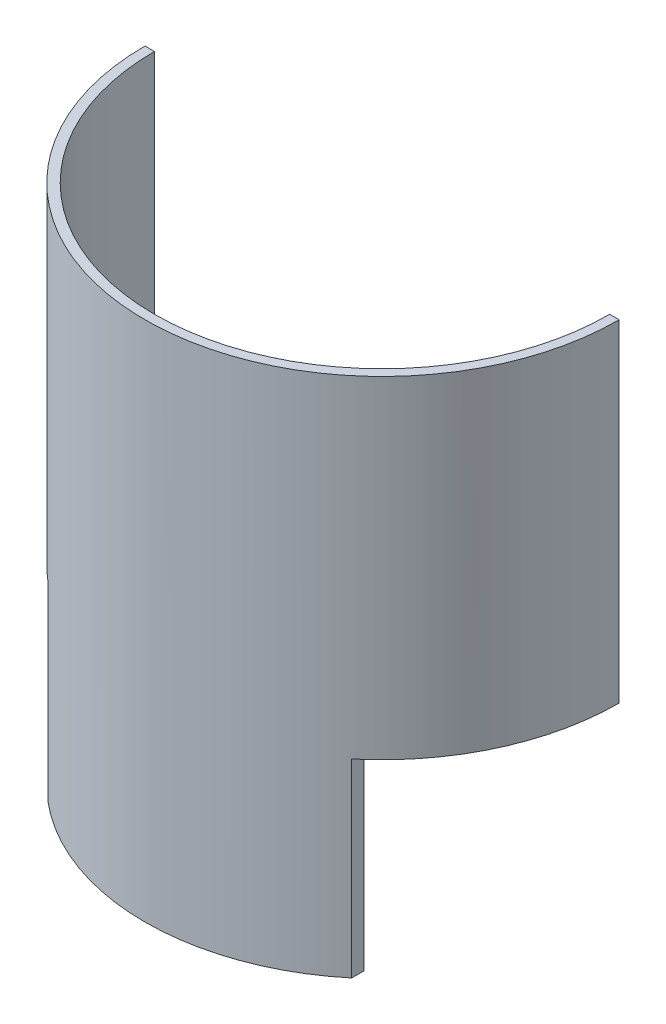
ISO-10303-21;
HEADER;
FILE_DESCRIPTION(('STEP AP214'),'2;1');
FILE_NAME('part.step','',(''),(''),'','','');
FILE_SCHEMA(('AUTOMOTIVE_DESIGN { 1 0 10303 214 1 1 1 1 }'));
ENDSEC;
DATA;
#1=APPLICATION_CONTEXT('core data for automotive mechanical design processes');
#2=APPLICATION_PROTOCOL_DEFINITION('international standard','automotive_design',2000,#1);
#3=PRODUCT_CONTEXT('',#1,'mechanical');
#4=PRODUCT('Part','Part','',(#3));
#5=PRODUCT_RELATED_PRODUCT_CATEGORY('part','',(#4));
#6=PRODUCT_DEFINITION_FORMATION('','',#4);
#7=PRODUCT_DEFINITION_CONTEXT('part definition',#1,'design');
#8=PRODUCT_DEFINITION('design','',#6,#7);
#9=PRODUCT_DEFINITION_SHAPE('','',#8);
#10=(LENGTH_UNIT() NAMED_UNIT(*) SI_UNIT(.MILLI.,.METRE.));
#11=(NAMED_UNIT(*) PLANE_ANGLE_UNIT() SI_UNIT($,.RADIAN.));
#12=(NAMED_UNIT(*) SI_UNIT($,.STERADIAN.) SOLID_ANGLE_UNIT());
#13=UNCERTAINTY_MEASURE_WITH_UNIT(LENGTH_MEASURE(1.E-05),#10,'distance_accuracy_value','');
#14=(GEOMETRIC_REPRESENTATION_CONTEXT(3) GLOBAL_UNCERTAINTY_ASSIGNED_CONTEXT((#13)) GLOBAL_UNIT_ASSIGNED_CONTEXT((#10,
#11,#12)) REPRESENTATION_CONTEXT('',''));
#15=CARTESIAN_POINT('',(0.,0.,0.));
#16=DIRECTION('',(0.,0.,1.));
#17=DIRECTION('',(1.,0.,0.));
#18=AXIS2_PLACEMENT_3D('',#15,#16,#17);
#19=CARTESIAN_POINT('',(0.,10.,0.));
#20=DIRECTION('',(0.,-1.,0.));
#21=DIRECTION('',(0.,0.,-1.));
#22=AXIS2_PLACEMENT_3D('',#19,#20,#21);
#23=CYLINDRICAL_SURFACE('',#22,12.);
#24=CARTESIAN_POINT('',(0.,0.,0.));
#25=DIRECTION('',(0.,1.,0.));
#26=DIRECTION('',(0.,0.,1.));
#27=AXIS2_PLACEMENT_3D('',#24,#25,#26);
#28=CIRCLE('',#27,12.);
#29=CARTESIAN_POINT('',(-8.,0.,8.94427190999916));
#30=VERTEX_POINT('',#29);
#31=CARTESIAN_POINT('',(8.,0.,8.94427190999916));
#32=VERTEX_POINT('',#31);
#33=EDGE_CURVE('E90',#30,#32,#28,.T.);
#34=ORIENTED_EDGE('',*,*,#33,.F.);
#35=DIRECTION('',(0.,-1.,0.));
#36=VECTOR('',#35,1.);
#37=CARTESIAN_POINT('',(-8.,10.,8.94427190999916));
#38=LINE('',#37,#36);
#39=CARTESIAN_POINT('',(-8.,10.,8.94427190999916));
#40=VERTEX_POINT('',#39);
#41=EDGE_CURVE('E11',#40,#30,#38,.T.);
#42=ORIENTED_EDGE('',*,*,#41,.F.);
#43=CARTESIAN_POINT('',(0.,10.,0.));
#44=DIRECTION('',(0.,1.,0.));
#45=DIRECTION('',(0.,0.,1.));
#46=AXIS2_PLACEMENT_3D('',#43,#44,#45);
#47=CIRCLE('',#46,12.);
#48=CARTESIAN_POINT('',(-12.,10.,0.));
#49=VERTEX_POINT('',#48);
#50=EDGE_CURVE('E112',#49,#40,#47,.T.);
#51=ORIENTED_EDGE('',*,*,#50,.F.);
#52=DIRECTION('',(0.,-1.,0.));
#53=VECTOR('',#52,1.);
#54=CARTESIAN_POINT('',(-12.,27.5,0.));
#55=LINE('',#54,#53);
#56=CARTESIAN_POINT('',(-12.,27.5,0.));
#57=VERTEX_POINT('',#56);
#58=EDGE_CURVE('E102',#57,#49,#55,.T.);
#59=ORIENTED_EDGE('',*,*,#58,.F.);
#60=CARTESIAN_POINT('',(0.,27.5,0.));
#61=DIRECTION('',(0.,1.,0.));
#62=DIRECTION('',(0.,0.,1.));
#63=AXIS2_PLACEMENT_3D('',#60,#61,#62);
#64=CIRCLE('',#63,12.);
#65=CARTESIAN_POINT('',(12.,27.5,0.));
#66=VERTEX_POINT('',#65);
#67=EDGE_CURVE('E129',#57,#66,#64,.T.);
#68=ORIENTED_EDGE('',*,*,#67,.T.);
#69=DIRECTION('',(0.,-1.,0.));
#70=VECTOR('',#69,1.);
#71=CARTESIAN_POINT('',(12.,27.5,0.));
#72=LINE('',#71,#70);
#73=CARTESIAN_POINT('',(12.,10.,0.));
#74=VERTEX_POINT('',#73);
#75=EDGE_CURVE('E135',#66,#74,#72,.T.);
#76=ORIENTED_EDGE('',*,*,#75,.T.);
#77=CARTESIAN_POINT('',(8.,10.,8.94427190999916));
#78=VERTEX_POINT('',#77);
#79=EDGE_CURVE('E165',#78,#74,#47,.T.);
#80=ORIENTED_EDGE('',*,*,#79,.F.);
#81=DIRECTION('',(0.,-1.,0.));
#82=VECTOR('',#81,1.);
#83=CARTESIAN_POINT('',(8.,10.,8.94427190999916));
#84=LINE('',#83,#82);
#85=EDGE_CURVE('E75',#78,#32,#84,.T.);
#86=ORIENTED_EDGE('',*,*,#85,.T.);
#87=EDGE_LOOP('',(#34,#42,#51,#59,#68,#76,#80,#86));
#88=FACE_BOUND('',#87,.T.);
#89=ADVANCED_FACE('F36',(#88),#23,.F.);
#90=CARTESIAN_POINT('',(-8.,10.,0.));
#91=DIRECTION('',(1.,0.,0.));
#92=DIRECTION('',(0.,0.,-1.));
#93=AXIS2_PLACEMENT_3D('',#90,#91,#92);
#94=PLANE('',#93);
#95=DIRECTION('',(0.,0.,1.));
#96=VECTOR('',#95,1.);
#97=CARTESIAN_POINT('',(-8.,0.,0.));
#98=LINE('',#97,#96);
#99=CARTESIAN_POINT('',(-8.,0.,9.60468635614927));
#100=VERTEX_POINT('',#99);
#101=EDGE_CURVE('E85',#30,#100,#98,.T.);
#102=ORIENTED_EDGE('',*,*,#101,.T.);
#103=DIRECTION('',(0.,-1.,0.));
#104=VECTOR('',#103,1.);
#105=CARTESIAN_POINT('',(-8.,10.,9.60468635614927));
#106=LINE('',#105,#104);
#107=CARTESIAN_POINT('',(-8.,10.,9.60468635614927));
#108=VERTEX_POINT('',#107);
#109=EDGE_CURVE('E44',#108,#100,#106,.T.);
#110=ORIENTED_EDGE('',*,*,#109,.F.);
#111=DIRECTION('',(0.,0.,1.));
#112=VECTOR('',#111,1.);
#113=CARTESIAN_POINT('',(-8.,10.,0.));
#114=LINE('',#113,#112);
#115=EDGE_CURVE('E91',#40,#108,#114,.T.);
#116=ORIENTED_EDGE('',*,*,#115,.F.);
#117=ORIENTED_EDGE('',*,*,#41,.T.);
#118=EDGE_LOOP('',(#102,#110,#116,#117));
#119=FACE_BOUND('',#118,.T.);
#120=ADVANCED_FACE('F104',(#119),#94,.F.);
#121=CARTESIAN_POINT('',(0.,10.,0.));
#122=DIRECTION('',(0.,-1.,0.));
#123=DIRECTION('',(0.,0.,-1.));
#124=AXIS2_PLACEMENT_3D('',#121,#122,#123);
#125=CYLINDRICAL_SURFACE('',#124,12.5);
#126=CARTESIAN_POINT('',(0.,0.,0.));
#127=DIRECTION('',(0.,1.,0.));
#128=DIRECTION('',(0.,0.,1.));
#129=AXIS2_PLACEMENT_3D('',#126,#127,#128);
#130=CIRCLE('',#129,12.5);
#131=CARTESIAN_POINT('',(8.,0.,9.60468635614927));
#132=VERTEX_POINT('',#131);
#133=EDGE_CURVE('E79',#100,#132,#130,.T.);
#134=ORIENTED_EDGE('',*,*,#133,.T.);
#135=DIRECTION('',(0.,-1.,0.));
#136=VECTOR('',#135,1.);
#137=CARTESIAN_POINT('',(8.,10.,9.60468635614927));
#138=LINE('',#137,#136);
#139=CARTESIAN_POINT('',(8.,10.,9.60468635614927));
#140=VERTEX_POINT('',#139);
#141=EDGE_CURVE('E67',#140,#132,#138,.T.);
#142=ORIENTED_EDGE('',*,*,#141,.F.);
#143=CARTESIAN_POINT('',(0.,10.,0.));
#144=DIRECTION('',(0.,1.,0.));
#145=DIRECTION('',(0.,0.,1.));
#146=AXIS2_PLACEMENT_3D('',#143,#144,#145);
#147=CIRCLE('',#146,12.5);
#148=CARTESIAN_POINT('',(12.5,10.,0.));
#149=VERTEX_POINT('',#148);
#150=EDGE_CURVE('E51',#140,#149,#147,.T.);
#151=ORIENTED_EDGE('',*,*,#150,.T.);
#152=DIRECTION('',(0.,-1.,0.));
#153=VECTOR('',#152,1.);
#154=CARTESIAN_POINT('',(12.5,27.5,0.));
#155=LINE('',#154,#153);
#156=CARTESIAN_POINT('',(12.5,27.5,0.));
#157=VERTEX_POINT('',#156);
#158=EDGE_CURVE('E138',#157,#149,#155,.T.);
#159=ORIENTED_EDGE('',*,*,#158,.F.);
#160=CARTESIAN_POINT('',(0.,27.5,0.));
#161=DIRECTION('',(0.,1.,0.));
#162=DIRECTION('',(0.,0.,1.));
#163=AXIS2_PLACEMENT_3D('',#160,#161,#162);
#164=CIRCLE('',#163,12.5);
#165=CARTESIAN_POINT('',(-12.5,27.5,0.));
#166=VERTEX_POINT('',#165);
#167=EDGE_CURVE('E161',#166,#157,#164,.T.);
#168=ORIENTED_EDGE('',*,*,#167,.F.);
#169=DIRECTION('',(0.,-1.,0.));
#170=VECTOR('',#169,1.);
#171=CARTESIAN_POINT('',(-12.5,27.5,0.));
#172=LINE('',#171,#170);
#173=CARTESIAN_POINT('',(-12.5,10.,0.));
#174=VERTEX_POINT('',#173);
#175=EDGE_CURVE('E126',#166,#174,#172,.T.);
#176=ORIENTED_EDGE('',*,*,#175,.T.);
#177=EDGE_CURVE('E121',#174,#108,#147,.T.);
#178=ORIENTED_EDGE('',*,*,#177,.T.);
#179=ORIENTED_EDGE('',*,*,#109,.T.);
#180=EDGE_LOOP('',(#134,#142,#151,#159,#168,#176,#178,#179));
#181=FACE_BOUND('',#180,.T.);
#182=ADVANCED_FACE('F80',(#181),#125,.T.);
#183=CARTESIAN_POINT('',(8.,10.,0.));
#184=DIRECTION('',(1.,0.,0.));
#185=DIRECTION('',(0.,0.,-1.));
#186=AXIS2_PLACEMENT_3D('',#183,#184,#185);
#187=PLANE('',#186);
#188=DIRECTION('',(0.,0.,1.));
#189=VECTOR('',#188,1.);
#190=CARTESIAN_POINT('',(8.,0.,0.));
#191=LINE('',#190,#189);
#192=EDGE_CURVE('E72',#32,#132,#191,.T.);
#193=ORIENTED_EDGE('',*,*,#192,.F.);
#194=ORIENTED_EDGE('',*,*,#85,.F.);
#195=DIRECTION('',(0.,0.,1.));
#196=VECTOR('',#195,1.);
#197=CARTESIAN_POINT('',(8.,10.,0.));
#198=LINE('',#197,#196);
#199=EDGE_CURVE('E73',#78,#140,#198,.T.);
#200=ORIENTED_EDGE('',*,*,#199,.T.);
#201=ORIENTED_EDGE('',*,*,#141,.T.);
#202=EDGE_LOOP('',(#193,#194,#200,#201));
#203=FACE_BOUND('',#202,.T.);
#204=ADVANCED_FACE('F69',(#203),#187,.T.);
#205=CARTESIAN_POINT('',(0.,0.,0.));
#206=DIRECTION('',(0.,1.,0.));
#207=DIRECTION('',(0.,0.,1.));
#208=AXIS2_PLACEMENT_3D('',#205,#206,#207);
#209=PLANE('',#208);
#210=ORIENTED_EDGE('',*,*,#33,.T.);
#211=ORIENTED_EDGE('',*,*,#192,.T.);
#212=ORIENTED_EDGE('',*,*,#133,.F.);
#213=ORIENTED_EDGE('',*,*,#101,.F.);
#214=EDGE_LOOP('',(#210,#211,#212,#213));
#215=FACE_BOUND('',#214,.T.);
#216=ADVANCED_FACE('F88',(#215),#209,.F.);
#217=CARTESIAN_POINT('',(0.,10.,0.));
#218=DIRECTION('',(0.,1.,0.));
#219=DIRECTION('',(0.,0.,1.));
#220=AXIS2_PLACEMENT_3D('',#217,#218,#219);
#221=PLANE('',#220);
#222=ORIENTED_EDGE('',*,*,#50,.T.);
#223=ORIENTED_EDGE('',*,*,#115,.T.);
#224=ORIENTED_EDGE('',*,*,#177,.F.);
#225=DIRECTION('',(1.,0.,0.));
#226=VECTOR('',#225,1.);
#227=CARTESIAN_POINT('',(0.,10.,0.));
#228=LINE('',#227,#226);
#229=EDGE_CURVE('E131',#174,#49,#228,.T.);
#230=ORIENTED_EDGE('',*,*,#229,.T.);
#231=EDGE_LOOP('',(#222,#223,#224,#230));
#232=FACE_BOUND('',#231,.T.);
#233=ADVANCED_FACE('F119',(#232),#221,.F.);
#234=CARTESIAN_POINT('',(0.,27.5,0.));
#235=DIRECTION('',(0.,0.,-1.));
#236=DIRECTION('',(-1.,0.,0.));
#237=AXIS2_PLACEMENT_3D('',#234,#235,#236);
#238=PLANE('',#237);
#239=ORIENTED_EDGE('',*,*,#229,.F.);
#240=ORIENTED_EDGE('',*,*,#175,.F.);
#241=DIRECTION('',(1.,0.,0.));
#242=VECTOR('',#241,1.);
#243=CARTESIAN_POINT('',(0.,27.5,0.));
#244=LINE('',#243,#242);
#245=EDGE_CURVE('E148',#166,#57,#244,.T.);
#246=ORIENTED_EDGE('',*,*,#245,.T.);
#247=ORIENTED_EDGE('',*,*,#58,.T.);
#248=EDGE_LOOP('',(#239,#240,#246,#247));
#249=FACE_BOUND('',#248,.T.);
#250=ADVANCED_FACE('F145',(#249),#238,.T.);
#251=CARTESIAN_POINT('',(0.,27.5,0.));
#252=DIRECTION('',(0.,0.,-1.));
#253=DIRECTION('',(-1.,0.,0.));
#254=AXIS2_PLACEMENT_3D('',#251,#252,#253);
#255=PLANE('',#254);
#256=DIRECTION('',(1.,0.,0.));
#257=VECTOR('',#256,1.);
#258=CARTESIAN_POINT('',(0.,10.,0.));
#259=LINE('',#258,#257);
#260=EDGE_CURVE('E127',#74,#149,#259,.T.);
#261=ORIENTED_EDGE('',*,*,#260,.F.);
#262=ORIENTED_EDGE('',*,*,#75,.F.);
#263=DIRECTION('',(1.,0.,0.));
#264=VECTOR('',#263,1.);
#265=CARTESIAN_POINT('',(0.,27.5,0.));
#266=LINE('',#265,#264);
#267=EDGE_CURVE('E139',#66,#157,#266,.T.);
#268=ORIENTED_EDGE('',*,*,#267,.T.);
#269=ORIENTED_EDGE('',*,*,#158,.T.);
#270=EDGE_LOOP('',(#261,#262,#268,#269));
#271=FACE_BOUND('',#270,.T.);
#272=ADVANCED_FACE('F173',(#271),#255,.T.);
#273=CARTESIAN_POINT('',(0.,27.5,0.));
#274=DIRECTION('',(0.,1.,0.));
#275=DIRECTION('',(0.,0.,1.));
#276=AXIS2_PLACEMENT_3D('',#273,#274,#275);
#277=PLANE('',#276);
#278=ORIENTED_EDGE('',*,*,#67,.F.);
#279=ORIENTED_EDGE('',*,*,#245,.F.);
#280=ORIENTED_EDGE('',*,*,#167,.T.);
#281=ORIENTED_EDGE('',*,*,#267,.F.);
#282=EDGE_LOOP('',(#278,#279,#280,#281));
#283=FACE_BOUND('',#282,.T.);
#284=ADVANCED_FACE('F157',(#283),#277,.T.);
#285=ORIENTED_EDGE('',*,*,#199,.F.);
#286=ORIENTED_EDGE('',*,*,#79,.T.);
#287=ORIENTED_EDGE('',*,*,#260,.T.);
#288=ORIENTED_EDGE('',*,*,#150,.F.);
#289=EDGE_LOOP('',(#285,#286,#287,#288));
#290=FACE_BOUND('',#289,.T.);
#291=ADVANCED_FACE('F167',(#290),#221,.F.);
#292=CLOSED_SHELL('',(#89,#120,#182,#204,#216,#233,#250,#272,#284,#291));
#293=MANIFOLD_SOLID_BREP('B2',#292);
#294=ADVANCED_BREP_SHAPE_REPRESENTATION('',(#18,#293),#14);
#295=SHAPE_DEFINITION_REPRESENTATION(#9,#294);
ENDSEC;
END-ISO-10303-21;
